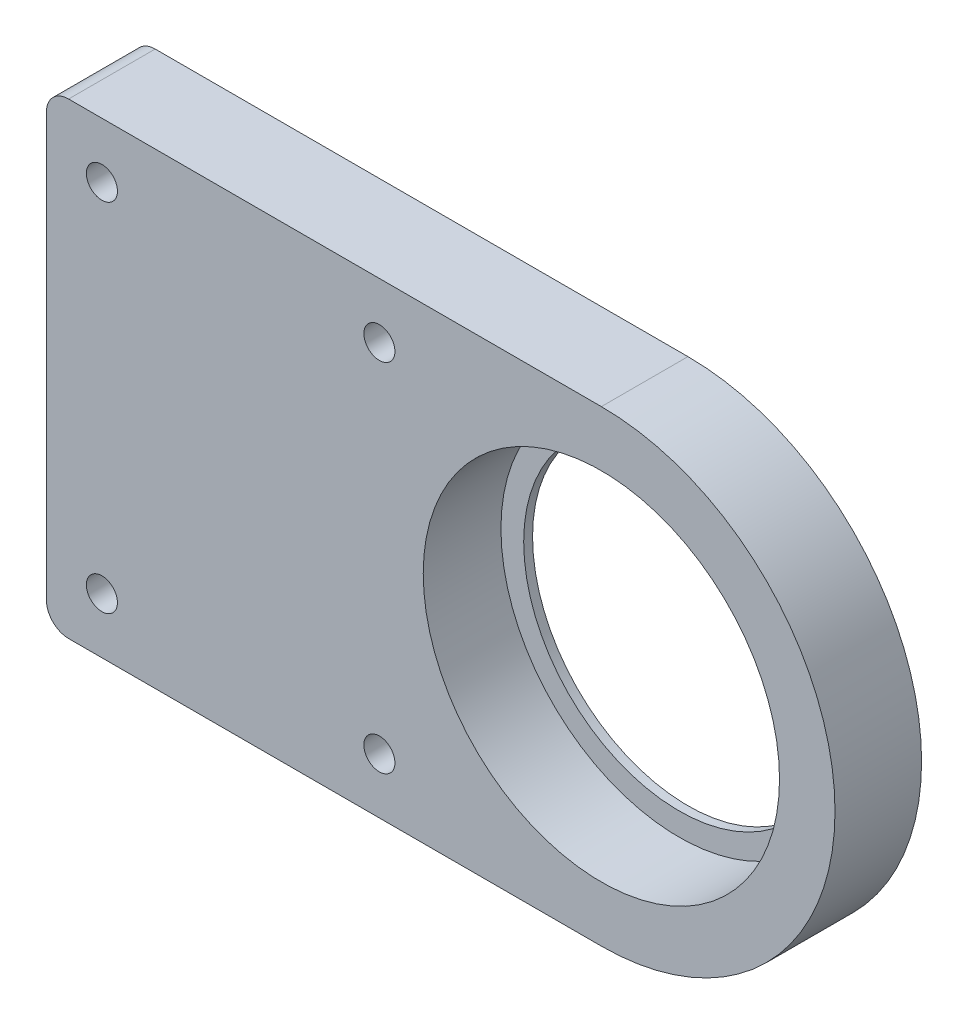
ISO-10303-21;
HEADER;
FILE_DESCRIPTION(('STEP AP214'),'2;1');
FILE_NAME('part.step','',(''),(''),'','','');
FILE_SCHEMA(('AUTOMOTIVE_DESIGN { 1 0 10303 214 1 1 1 1 }'));
ENDSEC;
DATA;
#1=APPLICATION_CONTEXT('core data for automotive mechanical design processes');
#2=APPLICATION_PROTOCOL_DEFINITION('international standard','automotive_design',2000,#1);
#3=PRODUCT_CONTEXT('',#1,'mechanical');
#4=PRODUCT('Part','Part','',(#3));
#5=PRODUCT_RELATED_PRODUCT_CATEGORY('part','',(#4));
#6=PRODUCT_DEFINITION_FORMATION('','',#4);
#7=PRODUCT_DEFINITION_CONTEXT('part definition',#1,'design');
#8=PRODUCT_DEFINITION('design','',#6,#7);
#9=PRODUCT_DEFINITION_SHAPE('','',#8);
#10=(LENGTH_UNIT() NAMED_UNIT(*) SI_UNIT(.MILLI.,.METRE.));
#11=(NAMED_UNIT(*) PLANE_ANGLE_UNIT() SI_UNIT($,.RADIAN.));
#12=(NAMED_UNIT(*) SI_UNIT($,.STERADIAN.) SOLID_ANGLE_UNIT());
#13=UNCERTAINTY_MEASURE_WITH_UNIT(LENGTH_MEASURE(1.E-05),#10,'distance_accuracy_value','');
#14=(GEOMETRIC_REPRESENTATION_CONTEXT(3) GLOBAL_UNCERTAINTY_ASSIGNED_CONTEXT((#13)) GLOBAL_UNIT_ASSIGNED_CONTEXT((#10,
#11,#12)) REPRESENTATION_CONTEXT('',''));
#15=CARTESIAN_POINT('',(0.,0.,0.));
#16=DIRECTION('',(0.,0.,1.));
#17=DIRECTION('',(1.,0.,0.));
#18=AXIS2_PLACEMENT_3D('',#15,#16,#17);
#19=CARTESIAN_POINT('',(0.,0.,-3.5));
#20=DIRECTION('',(0.,0.,1.));
#21=DIRECTION('',(1.,0.,0.));
#22=AXIS2_PLACEMENT_3D('',#19,#20,#21);
#23=CYLINDRICAL_SURFACE('',#22,21.05);
#24=DIRECTION('',(0.,0.,1.));
#25=VECTOR('',#24,1.);
#26=CARTESIAN_POINT('',(0.,21.05,-3.5));
#27=LINE('',#26,#25);
#28=CARTESIAN_POINT('',(0.,21.05,-4.3));
#29=VERTEX_POINT('',#28);
#30=CARTESIAN_POINT('',(0.,21.05,3.5));
#31=VERTEX_POINT('',#30);
#32=EDGE_CURVE('E100',#29,#31,#27,.T.);
#33=ORIENTED_EDGE('',*,*,#32,.T.);
#34=CARTESIAN_POINT('',(0.,0.,3.5));
#35=DIRECTION('',(0.,0.,1.));
#36=DIRECTION('',(1.,0.,0.));
#37=AXIS2_PLACEMENT_3D('',#34,#35,#36);
#38=CIRCLE('',#37,21.05);
#39=CARTESIAN_POINT('',(0.,-21.05,3.5));
#40=VERTEX_POINT('',#39);
#41=EDGE_CURVE('E98',#40,#31,#38,.T.);
#42=ORIENTED_EDGE('',*,*,#41,.F.);
#43=DIRECTION('',(0.,0.,1.));
#44=VECTOR('',#43,1.);
#45=CARTESIAN_POINT('',(0.,-21.05,-3.5));
#46=LINE('',#45,#44);
#47=CARTESIAN_POINT('',(0.,-21.05,-4.3));
#48=VERTEX_POINT('',#47);
#49=EDGE_CURVE('E94',#48,#40,#46,.T.);
#50=ORIENTED_EDGE('',*,*,#49,.F.);
#51=CARTESIAN_POINT('',(0.,0.,-4.3));
#52=DIRECTION('',(0.,0.,-1.));
#53=DIRECTION('',(-1.,0.,0.));
#54=AXIS2_PLACEMENT_3D('',#51,#52,#53);
#55=CIRCLE('',#54,21.05);
#56=EDGE_CURVE('E96',#29,#48,#55,.T.);
#57=ORIENTED_EDGE('',*,*,#56,.F.);
#58=EDGE_LOOP('',(#33,#42,#50,#57));
#59=FACE_BOUND('',#58,.T.);
#60=ADVANCED_FACE('F37',(#59),#23,.T.);
#61=CARTESIAN_POINT('',(0.,-21.05,-3.5));
#62=DIRECTION('',(0.,-1.,0.));
#63=DIRECTION('',(1.,0.,0.));
#64=AXIS2_PLACEMENT_3D('',#61,#62,#63);
#65=PLANE('',#64);
#66=DIRECTION('',(1.,0.,0.));
#67=VECTOR('',#66,1.);
#68=CARTESIAN_POINT('',(0.,-21.05,3.5));
#69=LINE('',#68,#67);
#70=CARTESIAN_POINT('',(-48.,-21.05,3.5));
#71=VERTEX_POINT('',#70);
#72=EDGE_CURVE('E130',#71,#40,#69,.T.);
#73=ORIENTED_EDGE('',*,*,#72,.F.);
#74=DIRECTION('',(0.,0.,1.));
#75=VECTOR('',#74,1.);
#76=CARTESIAN_POINT('',(-48.,-21.05,-3.5));
#77=LINE('',#76,#75);
#78=CARTESIAN_POINT('',(-48.,-21.05,-4.3));
#79=VERTEX_POINT('',#78);
#80=EDGE_CURVE('E60',#71,#79,#77,.F.);
#81=ORIENTED_EDGE('',*,*,#80,.T.);
#82=DIRECTION('',(-1.,0.,0.));
#83=VECTOR('',#82,1.);
#84=CARTESIAN_POINT('',(0.,-21.05,-4.3));
#85=LINE('',#84,#83);
#86=EDGE_CURVE('E102',#48,#79,#85,.T.);
#87=ORIENTED_EDGE('',*,*,#86,.F.);
#88=ORIENTED_EDGE('',*,*,#49,.T.);
#89=EDGE_LOOP('',(#73,#81,#87,#88));
#90=FACE_BOUND('',#89,.T.);
#91=ADVANCED_FACE('F103',(#90),#65,.T.);
#92=CARTESIAN_POINT('',(-50.,-21.05,-3.5));
#93=DIRECTION('',(-1.,0.,0.));
#94=DIRECTION('',(0.,0.,1.));
#95=AXIS2_PLACEMENT_3D('',#92,#93,#94);
#96=PLANE('',#95);
#97=DIRECTION('',(0.,1.,0.));
#98=VECTOR('',#97,1.);
#99=CARTESIAN_POINT('',(-50.,-21.05,-4.3));
#100=LINE('',#99,#98);
#101=CARTESIAN_POINT('',(-50.,-19.05,-4.3));
#102=VERTEX_POINT('',#101);
#103=CARTESIAN_POINT('',(-50.,19.05,-4.3));
#104=VERTEX_POINT('',#103);
#105=EDGE_CURVE('E105',#102,#104,#100,.T.);
#106=ORIENTED_EDGE('',*,*,#105,.F.);
#107=DIRECTION('',(0.,0.,1.));
#108=VECTOR('',#107,1.);
#109=CARTESIAN_POINT('',(-50.,-19.05,-3.5));
#110=LINE('',#109,#108);
#111=CARTESIAN_POINT('',(-50.,-19.05,3.5));
#112=VERTEX_POINT('',#111);
#113=EDGE_CURVE('E137',#102,#112,#110,.T.);
#114=ORIENTED_EDGE('',*,*,#113,.T.);
#115=DIRECTION('',(0.,-1.,0.));
#116=VECTOR('',#115,1.);
#117=CARTESIAN_POINT('',(-50.,-21.05,3.5));
#118=LINE('',#117,#116);
#119=CARTESIAN_POINT('',(-50.,19.05,3.5));
#120=VERTEX_POINT('',#119);
#121=EDGE_CURVE('E127',#120,#112,#118,.T.);
#122=ORIENTED_EDGE('',*,*,#121,.F.);
#123=DIRECTION('',(0.,0.,1.));
#124=VECTOR('',#123,1.);
#125=CARTESIAN_POINT('',(-50.,19.05,-3.5));
#126=LINE('',#125,#124);
#127=EDGE_CURVE('E99',#120,#104,#126,.F.);
#128=ORIENTED_EDGE('',*,*,#127,.T.);
#129=EDGE_LOOP('',(#106,#114,#122,#128));
#130=FACE_BOUND('',#129,.T.);
#131=ADVANCED_FACE('F149',(#130),#96,.T.);
#132=CARTESIAN_POINT('',(0.,21.05,-3.5));
#133=DIRECTION('',(0.,1.,0.));
#134=DIRECTION('',(-1.,0.,0.));
#135=AXIS2_PLACEMENT_3D('',#132,#133,#134);
#136=PLANE('',#135);
#137=DIRECTION('',(1.,0.,0.));
#138=VECTOR('',#137,1.);
#139=CARTESIAN_POINT('',(-50.,21.05,-4.3));
#140=LINE('',#139,#138);
#141=CARTESIAN_POINT('',(-48.,21.05,-4.3));
#142=VERTEX_POINT('',#141);
#143=EDGE_CURVE('E109',#142,#29,#140,.T.);
#144=ORIENTED_EDGE('',*,*,#143,.F.);
#145=DIRECTION('',(0.,0.,1.));
#146=VECTOR('',#145,1.);
#147=CARTESIAN_POINT('',(-48.,21.05,-3.5));
#148=LINE('',#147,#146);
#149=CARTESIAN_POINT('',(-48.,21.05,3.5));
#150=VERTEX_POINT('',#149);
#151=EDGE_CURVE('E11',#142,#150,#148,.T.);
#152=ORIENTED_EDGE('',*,*,#151,.T.);
#153=DIRECTION('',(-1.,0.,0.));
#154=VECTOR('',#153,1.);
#155=CARTESIAN_POINT('',(0.,21.05,3.5));
#156=LINE('',#155,#154);
#157=EDGE_CURVE('E124',#31,#150,#156,.T.);
#158=ORIENTED_EDGE('',*,*,#157,.F.);
#159=ORIENTED_EDGE('',*,*,#32,.F.);
#160=EDGE_LOOP('',(#144,#152,#158,#159));
#161=FACE_BOUND('',#160,.T.);
#162=ADVANCED_FACE('F160',(#161),#136,.T.);
#163=CARTESIAN_POINT('',(0.,0.,-3.5));
#164=DIRECTION('',(0.,0.,1.));
#165=DIRECTION('',(1.,0.,0.));
#166=AXIS2_PLACEMENT_3D('',#163,#164,#165);
#167=CYLINDRICAL_SURFACE('',#166,16.05);
#168=CARTESIAN_POINT('',(0.,0.,-3.5));
#169=DIRECTION('',(0.,0.,1.));
#170=DIRECTION('',(1.,0.,0.));
#171=AXIS2_PLACEMENT_3D('',#168,#169,#170);
#172=CIRCLE('',#171,16.05);
#173=CARTESIAN_POINT('',(16.05,0.,-3.5));
#174=VERTEX_POINT('',#173);
#175=EDGE_CURVE('E132',#174,#174,#172,.T.);
#176=ORIENTED_EDGE('',*,*,#175,.F.);
#177=EDGE_LOOP('',(#176));
#178=FACE_BOUND('',#177,.T.);
#179=CARTESIAN_POINT('',(0.,0.,3.5));
#180=DIRECTION('',(0.,0.,1.));
#181=DIRECTION('',(1.,0.,0.));
#182=AXIS2_PLACEMENT_3D('',#179,#180,#181);
#183=CIRCLE('',#182,16.05);
#184=CARTESIAN_POINT('',(16.05,0.,3.5));
#185=VERTEX_POINT('',#184);
#186=EDGE_CURVE('E120',#185,#185,#183,.T.);
#187=ORIENTED_EDGE('',*,*,#186,.T.);
#188=EDGE_LOOP('',(#187));
#189=FACE_BOUND('',#188,.T.);
#190=ADVANCED_FACE('F162',(#178,#189),#167,.F.);
#191=CARTESIAN_POINT('',(0.,0.,3.5));
#192=DIRECTION('',(0.,0.,1.));
#193=DIRECTION('',(1.,0.,0.));
#194=AXIS2_PLACEMENT_3D('',#191,#192,#193);
#195=PLANE('',#194);
#196=CARTESIAN_POINT('',(-20.,-16.05,3.5));
#197=DIRECTION('',(0.,0.,-1.));
#198=DIRECTION('',(-1.,0.,0.));
#199=AXIS2_PLACEMENT_3D('',#196,#197,#198);
#200=CIRCLE('',#199,1.4);
#201=CARTESIAN_POINT('',(-21.4,-16.05,3.5));
#202=VERTEX_POINT('',#201);
#203=EDGE_CURVE('E217',#202,#202,#200,.T.);
#204=ORIENTED_EDGE('',*,*,#203,.T.);
#205=EDGE_LOOP('',(#204));
#206=FACE_BOUND('',#205,.T.);
#207=CARTESIAN_POINT('',(-45.,-16.05,3.5));
#208=DIRECTION('',(0.,0.,-1.));
#209=DIRECTION('',(-1.,0.,0.));
#210=AXIS2_PLACEMENT_3D('',#207,#208,#209);
#211=CIRCLE('',#210,1.4);
#212=CARTESIAN_POINT('',(-46.4,-16.05,3.5));
#213=VERTEX_POINT('',#212);
#214=EDGE_CURVE('E221',#213,#213,#211,.T.);
#215=ORIENTED_EDGE('',*,*,#214,.T.);
#216=EDGE_LOOP('',(#215));
#217=FACE_BOUND('',#216,.T.);
#218=CARTESIAN_POINT('',(-45.,16.05,3.5));
#219=DIRECTION('',(0.,0.,-1.));
#220=DIRECTION('',(-1.,0.,0.));
#221=AXIS2_PLACEMENT_3D('',#218,#219,#220);
#222=CIRCLE('',#221,1.4);
#223=CARTESIAN_POINT('',(-46.4,16.05,3.5));
#224=VERTEX_POINT('',#223);
#225=EDGE_CURVE('E225',#224,#224,#222,.T.);
#226=ORIENTED_EDGE('',*,*,#225,.T.);
#227=EDGE_LOOP('',(#226));
#228=FACE_BOUND('',#227,.T.);
#229=CARTESIAN_POINT('',(-20.,16.05,3.5));
#230=DIRECTION('',(0.,0.,-1.));
#231=DIRECTION('',(-1.,0.,0.));
#232=AXIS2_PLACEMENT_3D('',#229,#230,#231);
#233=CIRCLE('',#232,1.4);
#234=CARTESIAN_POINT('',(-21.4,16.05,3.5));
#235=VERTEX_POINT('',#234);
#236=EDGE_CURVE('E228',#235,#235,#233,.T.);
#237=ORIENTED_EDGE('',*,*,#236,.T.);
#238=EDGE_LOOP('',(#237));
#239=FACE_BOUND('',#238,.T.);
#240=ORIENTED_EDGE('',*,*,#121,.T.);
#241=CARTESIAN_POINT('',(-48.,-19.05,3.5));
#242=DIRECTION('',(0.,0.,1.));
#243=DIRECTION('',(1.,0.,0.));
#244=AXIS2_PLACEMENT_3D('',#241,#242,#243);
#245=CIRCLE('',#244,2.);
#246=EDGE_CURVE('E142',#112,#71,#245,.T.);
#247=ORIENTED_EDGE('',*,*,#246,.T.);
#248=ORIENTED_EDGE('',*,*,#72,.T.);
#249=ORIENTED_EDGE('',*,*,#41,.T.);
#250=ORIENTED_EDGE('',*,*,#157,.T.);
#251=CARTESIAN_POINT('',(-48.,19.05,3.5));
#252=DIRECTION('',(0.,0.,1.));
#253=DIRECTION('',(1.,0.,0.));
#254=AXIS2_PLACEMENT_3D('',#251,#252,#253);
#255=CIRCLE('',#254,2.);
#256=EDGE_CURVE('E140',#150,#120,#255,.T.);
#257=ORIENTED_EDGE('',*,*,#256,.T.);
#258=EDGE_LOOP('',(#240,#247,#248,#249,#250,#257));
#259=FACE_BOUND('',#258,.T.);
#260=ORIENTED_EDGE('',*,*,#186,.F.);
#261=EDGE_LOOP('',(#260));
#262=FACE_BOUND('',#261,.T.);
#263=ADVANCED_FACE('F154',(#206,#217,#228,#239,#259,#262),#195,.T.);
#264=CARTESIAN_POINT('',(0.,0.,-3.5));
#265=DIRECTION('',(0.,0.,-1.));
#266=DIRECTION('',(-1.,0.,0.));
#267=AXIS2_PLACEMENT_3D('',#264,#265,#266);
#268=PLANE('',#267);
#269=CARTESIAN_POINT('',(0.,0.,-3.5));
#270=DIRECTION('',(0.,0.,-1.));
#271=DIRECTION('',(-1.,0.,0.));
#272=AXIS2_PLACEMENT_3D('',#269,#270,#271);
#273=CIRCLE('',#272,14.);
#274=CARTESIAN_POINT('',(-14.,0.,-3.5));
#275=VERTEX_POINT('',#274);
#276=EDGE_CURVE('E114',#275,#275,#273,.T.);
#277=ORIENTED_EDGE('',*,*,#276,.T.);
#278=EDGE_LOOP('',(#277));
#279=FACE_BOUND('',#278,.T.);
#280=ORIENTED_EDGE('',*,*,#175,.T.);
#281=EDGE_LOOP('',(#280));
#282=FACE_BOUND('',#281,.T.);
#283=ADVANCED_FACE('F206',(#279,#282),#268,.F.);
#284=CARTESIAN_POINT('',(0.,0.,-4.3));
#285=DIRECTION('',(0.,0.,-1.));
#286=DIRECTION('',(-1.,0.,0.));
#287=AXIS2_PLACEMENT_3D('',#284,#285,#286);
#288=PLANE('',#287);
#289=CARTESIAN_POINT('',(-20.,-16.05,-4.3));
#290=DIRECTION('',(0.,0.,-1.));
#291=DIRECTION('',(-1.,0.,0.));
#292=AXIS2_PLACEMENT_3D('',#289,#290,#291);
#293=CIRCLE('',#292,1.4);
#294=CARTESIAN_POINT('',(-21.4,-16.05,-4.3));
#295=VERTEX_POINT('',#294);
#296=EDGE_CURVE('E237',#295,#295,#293,.T.);
#297=ORIENTED_EDGE('',*,*,#296,.F.);
#298=EDGE_LOOP('',(#297));
#299=FACE_BOUND('',#298,.T.);
#300=CARTESIAN_POINT('',(-45.,-16.05,-4.3));
#301=DIRECTION('',(0.,0.,-1.));
#302=DIRECTION('',(-1.,0.,0.));
#303=AXIS2_PLACEMENT_3D('',#300,#301,#302);
#304=CIRCLE('',#303,1.4);
#305=CARTESIAN_POINT('',(-46.4,-16.05,-4.3));
#306=VERTEX_POINT('',#305);
#307=EDGE_CURVE('E241',#306,#306,#304,.T.);
#308=ORIENTED_EDGE('',*,*,#307,.F.);
#309=EDGE_LOOP('',(#308));
#310=FACE_BOUND('',#309,.T.);
#311=CARTESIAN_POINT('',(-45.,16.05,-4.3));
#312=DIRECTION('',(0.,0.,-1.));
#313=DIRECTION('',(-1.,0.,0.));
#314=AXIS2_PLACEMENT_3D('',#311,#312,#313);
#315=CIRCLE('',#314,1.4);
#316=CARTESIAN_POINT('',(-46.4,16.05,-4.3));
#317=VERTEX_POINT('',#316);
#318=EDGE_CURVE('E233',#317,#317,#315,.T.);
#319=ORIENTED_EDGE('',*,*,#318,.F.);
#320=EDGE_LOOP('',(#319));
#321=FACE_BOUND('',#320,.T.);
#322=CARTESIAN_POINT('',(-20.,16.05,-4.3));
#323=DIRECTION('',(0.,0.,-1.));
#324=DIRECTION('',(-1.,0.,0.));
#325=AXIS2_PLACEMENT_3D('',#322,#323,#324);
#326=CIRCLE('',#325,1.4);
#327=CARTESIAN_POINT('',(-21.4,16.05,-4.3));
#328=VERTEX_POINT('',#327);
#329=EDGE_CURVE('E229',#328,#328,#326,.T.);
#330=ORIENTED_EDGE('',*,*,#329,.F.);
#331=EDGE_LOOP('',(#330));
#332=FACE_BOUND('',#331,.T.);
#333=ORIENTED_EDGE('',*,*,#86,.T.);
#334=CARTESIAN_POINT('',(-48.,-19.05,-4.3));
#335=DIRECTION('',(0.,0.,-1.));
#336=DIRECTION('',(-1.,0.,0.));
#337=AXIS2_PLACEMENT_3D('',#334,#335,#336);
#338=CIRCLE('',#337,2.);
#339=EDGE_CURVE('E45',#79,#102,#338,.T.);
#340=ORIENTED_EDGE('',*,*,#339,.T.);
#341=ORIENTED_EDGE('',*,*,#105,.T.);
#342=CARTESIAN_POINT('',(-48.,19.05,-4.3));
#343=DIRECTION('',(0.,0.,-1.));
#344=DIRECTION('',(-1.,0.,0.));
#345=AXIS2_PLACEMENT_3D('',#342,#343,#344);
#346=CIRCLE('',#345,2.);
#347=EDGE_CURVE('E52',#104,#142,#346,.T.);
#348=ORIENTED_EDGE('',*,*,#347,.T.);
#349=ORIENTED_EDGE('',*,*,#143,.T.);
#350=ORIENTED_EDGE('',*,*,#56,.T.);
#351=EDGE_LOOP('',(#333,#340,#341,#348,#349,#350));
#352=FACE_BOUND('',#351,.T.);
#353=CARTESIAN_POINT('',(0.,0.,-4.3));
#354=DIRECTION('',(0.,0.,-1.));
#355=DIRECTION('',(-1.,0.,0.));
#356=AXIS2_PLACEMENT_3D('',#353,#354,#355);
#357=CIRCLE('',#356,14.);
#358=CARTESIAN_POINT('',(-14.,0.,-4.3));
#359=VERTEX_POINT('',#358);
#360=EDGE_CURVE('E111',#359,#359,#357,.T.);
#361=ORIENTED_EDGE('',*,*,#360,.F.);
#362=EDGE_LOOP('',(#361));
#363=FACE_BOUND('',#362,.T.);
#364=ADVANCED_FACE('F107',(#299,#310,#321,#332,#352,#363),#288,.T.);
#365=CARTESIAN_POINT('',(0.,0.,-4.3));
#366=DIRECTION('',(0.,0.,1.));
#367=DIRECTION('',(1.,0.,0.));
#368=AXIS2_PLACEMENT_3D('',#365,#366,#367);
#369=CYLINDRICAL_SURFACE('',#368,14.);
#370=ORIENTED_EDGE('',*,*,#360,.T.);
#371=EDGE_LOOP('',(#370));
#372=FACE_BOUND('',#371,.T.);
#373=ORIENTED_EDGE('',*,*,#276,.F.);
#374=EDGE_LOOP('',(#373));
#375=FACE_BOUND('',#374,.T.);
#376=ADVANCED_FACE('F199',(#372,#375),#369,.F.);
#377=CARTESIAN_POINT('',(-20.,16.05,3.5));
#378=DIRECTION('',(0.,0.,-1.));
#379=DIRECTION('',(-1.,0.,0.));
#380=AXIS2_PLACEMENT_3D('',#377,#378,#379);
#381=CYLINDRICAL_SURFACE('',#380,1.4);
#382=ORIENTED_EDGE('',*,*,#236,.F.);
#383=EDGE_LOOP('',(#382));
#384=FACE_BOUND('',#383,.T.);
#385=ORIENTED_EDGE('',*,*,#329,.T.);
#386=EDGE_LOOP('',(#385));
#387=FACE_BOUND('',#386,.T.);
#388=ADVANCED_FACE('F196',(#384,#387),#381,.F.);
#389=CARTESIAN_POINT('',(-45.,16.05,3.5));
#390=DIRECTION('',(0.,0.,-1.));
#391=DIRECTION('',(-1.,0.,0.));
#392=AXIS2_PLACEMENT_3D('',#389,#390,#391);
#393=CYLINDRICAL_SURFACE('',#392,1.4);
#394=ORIENTED_EDGE('',*,*,#225,.F.);
#395=EDGE_LOOP('',(#394));
#396=FACE_BOUND('',#395,.T.);
#397=ORIENTED_EDGE('',*,*,#318,.T.);
#398=EDGE_LOOP('',(#397));
#399=FACE_BOUND('',#398,.T.);
#400=ADVANCED_FACE('F189',(#396,#399),#393,.F.);
#401=CARTESIAN_POINT('',(-45.,-16.05,3.5));
#402=DIRECTION('',(0.,0.,-1.));
#403=DIRECTION('',(-1.,0.,0.));
#404=AXIS2_PLACEMENT_3D('',#401,#402,#403);
#405=CYLINDRICAL_SURFACE('',#404,1.4);
#406=ORIENTED_EDGE('',*,*,#214,.F.);
#407=EDGE_LOOP('',(#406));
#408=FACE_BOUND('',#407,.T.);
#409=ORIENTED_EDGE('',*,*,#307,.T.);
#410=EDGE_LOOP('',(#409));
#411=FACE_BOUND('',#410,.T.);
#412=ADVANCED_FACE('F183',(#408,#411),#405,.F.);
#413=CARTESIAN_POINT('',(-20.,-16.05,3.5));
#414=DIRECTION('',(0.,0.,-1.));
#415=DIRECTION('',(-1.,0.,0.));
#416=AXIS2_PLACEMENT_3D('',#413,#414,#415);
#417=CYLINDRICAL_SURFACE('',#416,1.4);
#418=ORIENTED_EDGE('',*,*,#203,.F.);
#419=EDGE_LOOP('',(#418));
#420=FACE_BOUND('',#419,.T.);
#421=ORIENTED_EDGE('',*,*,#296,.T.);
#422=EDGE_LOOP('',(#421));
#423=FACE_BOUND('',#422,.T.);
#424=ADVANCED_FACE('F178',(#420,#423),#417,.F.);
#425=CARTESIAN_POINT('',(-48.,-19.05,-3.5));
#426=DIRECTION('',(0.,0.,1.));
#427=DIRECTION('',(1.,0.,0.));
#428=AXIS2_PLACEMENT_3D('',#425,#426,#427);
#429=CYLINDRICAL_SURFACE('',#428,2.);
#430=ORIENTED_EDGE('',*,*,#339,.F.);
#431=ORIENTED_EDGE('',*,*,#80,.F.);
#432=ORIENTED_EDGE('',*,*,#246,.F.);
#433=ORIENTED_EDGE('',*,*,#113,.F.);
#434=EDGE_LOOP('',(#430,#431,#432,#433));
#435=FACE_BOUND('',#434,.T.);
#436=ADVANCED_FACE('F152',(#435),#429,.T.);
#437=CARTESIAN_POINT('',(-48.,19.05,-3.5));
#438=DIRECTION('',(0.,0.,1.));
#439=DIRECTION('',(1.,0.,0.));
#440=AXIS2_PLACEMENT_3D('',#437,#438,#439);
#441=CYLINDRICAL_SURFACE('',#440,2.);
#442=ORIENTED_EDGE('',*,*,#347,.F.);
#443=ORIENTED_EDGE('',*,*,#127,.F.);
#444=ORIENTED_EDGE('',*,*,#256,.F.);
#445=ORIENTED_EDGE('',*,*,#151,.F.);
#446=EDGE_LOOP('',(#442,#443,#444,#445));
#447=FACE_BOUND('',#446,.T.);
#448=ADVANCED_FACE('F39',(#447),#441,.T.);
#449=CLOSED_SHELL('',(#60,#91,#131,#162,#190,#263,#283,#364,#376,#388,#400,#412,#424,#436,#448));
#450=MANIFOLD_SOLID_BREP('B2',#449);
#451=ADVANCED_BREP_SHAPE_REPRESENTATION('',(#18,#450),#14);
#452=SHAPE_DEFINITION_REPRESENTATION(#9,#451);
ENDSEC;
END-ISO-10303-21;
